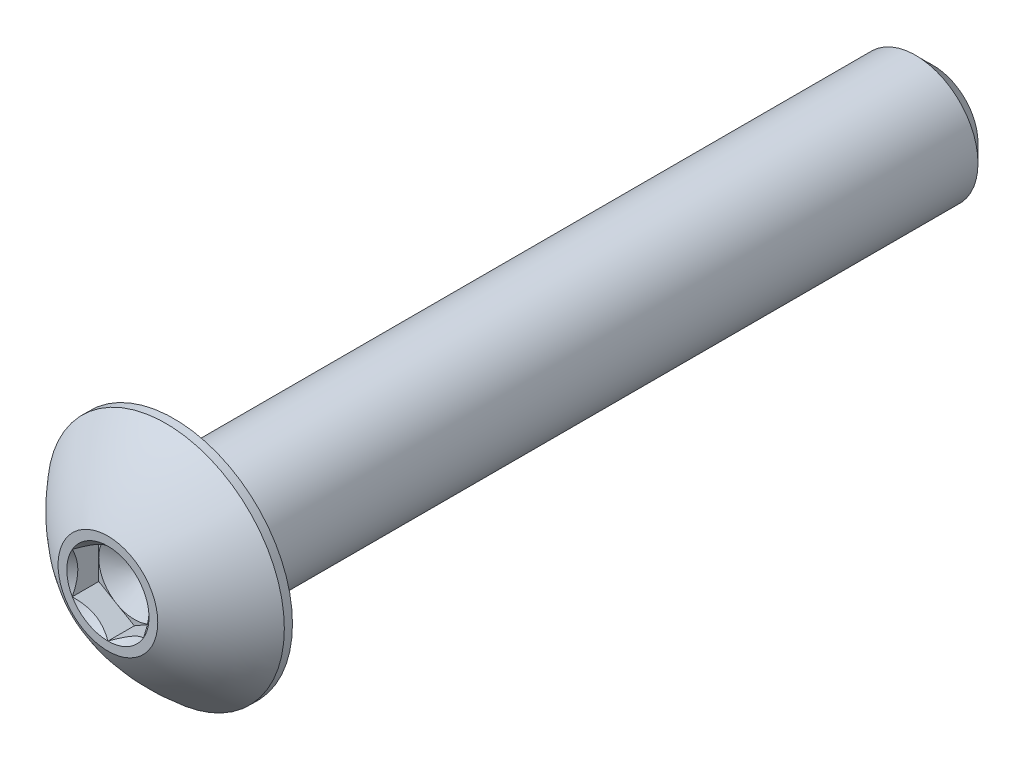
ISO-10303-21;
HEADER;
FILE_DESCRIPTION(('STEP AP214'),'2;1');
FILE_NAME('part.step','',(''),(''),'','','');
FILE_SCHEMA(('AUTOMOTIVE_DESIGN { 1 0 10303 214 1 1 1 1 }'));
ENDSEC;
DATA;
#1=APPLICATION_CONTEXT('core data for automotive mechanical design processes');
#2=APPLICATION_PROTOCOL_DEFINITION('international standard','automotive_design',2000,#1);
#3=PRODUCT_CONTEXT('',#1,'mechanical');
#4=PRODUCT('Part','Part','',(#3));
#5=PRODUCT_RELATED_PRODUCT_CATEGORY('part','',(#4));
#6=PRODUCT_DEFINITION_FORMATION('','',#4);
#7=PRODUCT_DEFINITION_CONTEXT('part definition',#1,'design');
#8=PRODUCT_DEFINITION('design','',#6,#7);
#9=PRODUCT_DEFINITION_SHAPE('','',#8);
#10=(LENGTH_UNIT() NAMED_UNIT(*) SI_UNIT(.MILLI.,.METRE.));
#11=(NAMED_UNIT(*) PLANE_ANGLE_UNIT() SI_UNIT($,.RADIAN.));
#12=(NAMED_UNIT(*) SI_UNIT($,.STERADIAN.) SOLID_ANGLE_UNIT());
#13=UNCERTAINTY_MEASURE_WITH_UNIT(LENGTH_MEASURE(1.E-05),#10,'distance_accuracy_value','');
#14=(GEOMETRIC_REPRESENTATION_CONTEXT(3) GLOBAL_UNCERTAINTY_ASSIGNED_CONTEXT((#13)) GLOBAL_UNIT_ASSIGNED_CONTEXT((#10,
#11,#12)) REPRESENTATION_CONTEXT('',''));
#15=CARTESIAN_POINT('',(0.,0.,0.));
#16=DIRECTION('',(0.,0.,1.));
#17=DIRECTION('',(1.,0.,0.));
#18=AXIS2_PLACEMENT_3D('',#15,#16,#17);
#19=CARTESIAN_POINT('',(0.,1.190625,13.8049));
#20=DIRECTION('',(0.,0.,-1.));
#21=DIRECTION('',(-1.,0.,0.));
#22=AXIS2_PLACEMENT_3D('',#19,#20,#21);
#23=PLANE('',#22);
#24=CARTESIAN_POINT('',(0.,0.,13.8049));
#25=DIRECTION('',(0.,0.,1.));
#26=DIRECTION('',(1.,0.,0.));
#27=AXIS2_PLACEMENT_3D('',#24,#25,#26);
#28=CIRCLE('',#27,1.666875);
#29=CARTESIAN_POINT('',(1.666875,0.,13.8049));
#30=VERTEX_POINT('',#29);
#31=EDGE_CURVE('E169',#30,#30,#28,.T.);
#32=ORIENTED_EDGE('',*,*,#31,.T.);
#33=EDGE_LOOP('',(#32));
#34=FACE_BOUND('',#33,.T.);
#35=CARTESIAN_POINT('',(0.,0.,13.8049));
#36=DIRECTION('',(0.,0.,1.));
#37=DIRECTION('',(1.,0.,0.));
#38=AXIS2_PLACEMENT_3D('',#35,#36,#37);
#39=CIRCLE('',#38,1.37481532850779);
#40=CARTESIAN_POINT('',(0.,1.3748153285078,13.8049));
#41=VERTEX_POINT('',#40);
#42=CARTESIAN_POINT('',(-1.190625,0.687407664253895,13.8049));
#43=VERTEX_POINT('',#42);
#44=EDGE_CURVE('E123',#41,#43,#39,.T.);
#45=ORIENTED_EDGE('',*,*,#44,.F.);
#46=CARTESIAN_POINT('',(0.,0.,13.8049));
#47=DIRECTION('',(0.,0.,1.));
#48=DIRECTION('',(1.,0.,0.));
#49=AXIS2_PLACEMENT_3D('',#46,#47,#48);
#50=CIRCLE('',#49,1.37481532850779);
#51=CARTESIAN_POINT('',(1.190625,0.687407664253901,13.8049));
#52=VERTEX_POINT('',#51);
#53=EDGE_CURVE('E108',#52,#41,#50,.T.);
#54=ORIENTED_EDGE('',*,*,#53,.F.);
#55=CARTESIAN_POINT('',(0.,0.,13.8049));
#56=DIRECTION('',(0.,0.,1.));
#57=DIRECTION('',(1.,0.,0.));
#58=AXIS2_PLACEMENT_3D('',#55,#56,#57);
#59=CIRCLE('',#58,1.37481532850779);
#60=CARTESIAN_POINT('',(1.190625,-0.6874076642539,13.8049));
#61=VERTEX_POINT('',#60);
#62=EDGE_CURVE('E119',#61,#52,#59,.T.);
#63=ORIENTED_EDGE('',*,*,#62,.F.);
#64=CARTESIAN_POINT('',(0.,0.,13.8049));
#65=DIRECTION('',(0.,0.,1.));
#66=DIRECTION('',(1.,0.,0.));
#67=AXIS2_PLACEMENT_3D('',#64,#65,#66);
#68=CIRCLE('',#67,1.37481532850779);
#69=CARTESIAN_POINT('',(0.,-1.3748153285078,13.8049));
#70=VERTEX_POINT('',#69);
#71=EDGE_CURVE('E140',#70,#61,#68,.T.);
#72=ORIENTED_EDGE('',*,*,#71,.F.);
#73=CARTESIAN_POINT('',(0.,0.,13.8049));
#74=DIRECTION('',(0.,0.,1.));
#75=DIRECTION('',(1.,0.,0.));
#76=AXIS2_PLACEMENT_3D('',#73,#74,#75);
#77=CIRCLE('',#76,1.37481532850779);
#78=CARTESIAN_POINT('',(-1.190625,-0.687407664253895,13.8049));
#79=VERTEX_POINT('',#78);
#80=EDGE_CURVE('E396',#79,#70,#77,.T.);
#81=ORIENTED_EDGE('',*,*,#80,.F.);
#82=CARTESIAN_POINT('',(0.,0.,13.8049));
#83=DIRECTION('',(0.,0.,1.));
#84=DIRECTION('',(1.,0.,0.));
#85=AXIS2_PLACEMENT_3D('',#82,#83,#84);
#86=CIRCLE('',#85,1.37481532850779);
#87=EDGE_CURVE('E405',#43,#79,#86,.T.);
#88=ORIENTED_EDGE('',*,*,#87,.F.);
#89=EDGE_LOOP('',(#45,#54,#63,#72,#81,#88));
#90=FACE_BOUND('',#89,.T.);
#91=ADVANCED_FACE('F35',(#34,#90),#23,.F.);
#92=CARTESIAN_POINT('',(0.,0.,-13.8049));
#93=DIRECTION('',(0.,0.,1.));
#94=DIRECTION('',(1.,0.,0.));
#95=AXIS2_PLACEMENT_3D('',#92,#93,#94);
#96=CONICAL_SURFACE('',#95,1.4874875,0.785398163397447);
#97=CARTESIAN_POINT('',(0.,0.,-13.2095875));
#98=DIRECTION('',(0.,0.,1.));
#99=DIRECTION('',(1.,0.,0.));
#100=AXIS2_PLACEMENT_3D('',#97,#98,#99);
#101=CIRCLE('',#100,2.0828);
#102=CARTESIAN_POINT('',(2.0828,0.,-13.2095875));
#103=VERTEX_POINT('',#102);
#104=EDGE_CURVE('E11',#103,#103,#101,.T.);
#105=ORIENTED_EDGE('',*,*,#104,.F.);
#106=EDGE_LOOP('',(#105));
#107=FACE_BOUND('',#106,.T.);
#108=CARTESIAN_POINT('',(0.,0.,-13.8049));
#109=DIRECTION('',(0.,0.,1.));
#110=DIRECTION('',(1.,0.,0.));
#111=AXIS2_PLACEMENT_3D('',#108,#109,#110);
#112=CIRCLE('',#111,1.4874875);
#113=CARTESIAN_POINT('',(1.4874875,0.,-13.8049));
#114=VERTEX_POINT('',#113);
#115=EDGE_CURVE('E162',#114,#114,#112,.T.);
#116=ORIENTED_EDGE('',*,*,#115,.T.);
#117=EDGE_LOOP('',(#116));
#118=FACE_BOUND('',#117,.T.);
#119=ADVANCED_FACE('F37',(#107,#118),#96,.T.);
#120=CARTESIAN_POINT('',(0.,0.,13.8049));
#121=DIRECTION('',(0.,0.,1.));
#122=DIRECTION('',(1.,0.,0.));
#123=AXIS2_PLACEMENT_3D('',#120,#121,#122);
#124=CYLINDRICAL_SURFACE('',#123,2.0828);
#125=CARTESIAN_POINT('',(0.,0.,11.5951));
#126=DIRECTION('',(0.,0.,1.));
#127=DIRECTION('',(1.,0.,0.));
#128=AXIS2_PLACEMENT_3D('',#125,#126,#127);
#129=CIRCLE('',#128,2.0828);
#130=CARTESIAN_POINT('',(2.0828,0.,11.5951));
#131=VERTEX_POINT('',#130);
#132=EDGE_CURVE('E43',#131,#131,#129,.T.);
#133=ORIENTED_EDGE('',*,*,#132,.F.);
#134=EDGE_LOOP('',(#133));
#135=FACE_BOUND('',#134,.T.);
#136=ORIENTED_EDGE('',*,*,#104,.T.);
#137=EDGE_LOOP('',(#136));
#138=FACE_BOUND('',#137,.T.);
#139=ADVANCED_FACE('F183',(#135,#138),#124,.T.);
#140=CARTESIAN_POINT('',(0.,3.9624,11.5951));
#141=DIRECTION('',(0.,0.,1.));
#142=DIRECTION('',(1.,0.,0.));
#143=AXIS2_PLACEMENT_3D('',#140,#141,#142);
#144=PLANE('',#143);
#145=CARTESIAN_POINT('',(0.,0.,11.5951));
#146=DIRECTION('',(0.,0.,1.));
#147=DIRECTION('',(1.,0.,0.));
#148=AXIS2_PLACEMENT_3D('',#145,#146,#147);
#149=CIRCLE('',#148,3.9624);
#150=CARTESIAN_POINT('',(3.9624,0.,11.5951));
#151=VERTEX_POINT('',#150);
#152=EDGE_CURVE('E176',#151,#151,#149,.T.);
#153=ORIENTED_EDGE('',*,*,#152,.F.);
#154=EDGE_LOOP('',(#153));
#155=FACE_BOUND('',#154,.T.);
#156=ORIENTED_EDGE('',*,*,#132,.T.);
#157=EDGE_LOOP('',(#156));
#158=FACE_BOUND('',#157,.T.);
#159=ADVANCED_FACE('F181',(#155,#158),#144,.F.);
#160=CARTESIAN_POINT('',(0.,0.,13.8049));
#161=DIRECTION('',(0.,0.,1.));
#162=DIRECTION('',(1.,0.,0.));
#163=AXIS2_PLACEMENT_3D('',#160,#161,#162);
#164=CYLINDRICAL_SURFACE('',#163,3.9624);
#165=CARTESIAN_POINT('',(0.,0.,11.8672428571429));
#166=DIRECTION('',(0.,0.,1.));
#167=DIRECTION('',(1.,0.,0.));
#168=AXIS2_PLACEMENT_3D('',#165,#166,#167);
#169=CIRCLE('',#168,3.9624);
#170=CARTESIAN_POINT('',(3.9624,0.,11.8672428571429));
#171=VERTEX_POINT('',#170);
#172=EDGE_CURVE('E173',#171,#171,#169,.T.);
#173=ORIENTED_EDGE('',*,*,#172,.F.);
#174=EDGE_LOOP('',(#173));
#175=FACE_BOUND('',#174,.T.);
#176=ORIENTED_EDGE('',*,*,#152,.T.);
#177=EDGE_LOOP('',(#176));
#178=FACE_BOUND('',#177,.T.);
#179=ADVANCED_FACE('F203',(#175,#178),#164,.T.);
#180=CARTESIAN_POINT('',(0.,0.,6.43642703996249));
#181=DIRECTION('',(0.,0.,1.));
#182=DIRECTION('',(1.,0.,0.));
#183=AXIS2_PLACEMENT_3D('',#180,#181,#182);
#184=DEGENERATE_TOROIDAL_SURFACE('',#183,2.58731484699415,8.50837969398828,.F.);
#185=ORIENTED_EDGE('',*,*,#31,.F.);
#186=EDGE_LOOP('',(#185));
#187=FACE_BOUND('',#186,.T.);
#188=ORIENTED_EDGE('',*,*,#172,.T.);
#189=EDGE_LOOP('',(#188));
#190=FACE_BOUND('',#189,.T.);
#191=ADVANCED_FACE('F194',(#187,#190),#184,.F.);
#192=CARTESIAN_POINT('',(0.,1.4874875,-13.8049));
#193=DIRECTION('',(0.,0.,1.));
#194=DIRECTION('',(1.,0.,0.));
#195=AXIS2_PLACEMENT_3D('',#192,#193,#194);
#196=PLANE('',#195);
#197=ORIENTED_EDGE('',*,*,#115,.F.);
#198=EDGE_LOOP('',(#197));
#199=FACE_BOUND('',#198,.T.);
#200=ADVANCED_FACE('F192',(#199),#196,.F.);
#201=CARTESIAN_POINT('',(1.190625,0.687407664253899,13.8049));
#202=DIRECTION('',(-0.499999999999999,-0.866025403784439,0.));
#203=DIRECTION('',(0.866025403784439,-0.499999999999999,0.));
#204=AXIS2_PLACEMENT_3D('',#201,#202,#203);
#205=PLANE('',#204);
#206=CARTESIAN_POINT('',(1.190825,0.687292194200061,13.8050154846));
#207=CARTESIAN_POINT('',(1.14989058041014,0.710925692369386,13.7813987642143));
#208=CARTESIAN_POINT('',(1.10827161169802,0.734954415158721,13.7591687817231));
#209=CARTESIAN_POINT('',(1.02340555632636,0.78395185507261,13.7184656626274));
#210=CARTESIAN_POINT('',(0.980150392709037,0.808925235430915,13.7000151826476));
#211=CARTESIAN_POINT('',(0.892928352542574,0.859282903800291,13.6684088380043));
#212=CARTESIAN_POINT('',(0.848983705042073,0.884654357864148,13.6551735042433));
#213=CARTESIAN_POINT('',(0.760126625836305,0.935956016463003,13.6347814515754));
#214=CARTESIAN_POINT('',(0.715216911165243,0.961884652317569,13.627609502896));
#215=CARTESIAN_POINT('',(0.63782087234302,1.00656927616579,13.6211385386489));
#216=CARTESIAN_POINT('',(0.605434587484352,1.02526750644699,13.6201803201468));
#217=CARTESIAN_POINT('',(0.540718926682229,1.06263111063188,13.6217926490721));
#218=CARTESIAN_POINT('',(0.508389564872726,1.08129647637533,13.6243639751796));
#219=CARTESIAN_POINT('',(0.444042843928514,1.11844707303394,13.6328867539936));
#220=CARTESIAN_POINT('',(0.412025803663231,1.13693211984976,13.6388413547526));
#221=CARTESIAN_POINT('',(0.348526236603542,1.17359361198509,13.6538099640712));
#222=CARTESIAN_POINT('',(0.317043945355834,1.19176992131166,13.6628252859121));
#223=CARTESIAN_POINT('',(0.236410161427872,1.23832385816825,13.689582295838));
#224=CARTESIAN_POINT('',(0.18776716473234,1.2664079054046,13.709336814436));
#225=CARTESIAN_POINT('',(0.0923855836478791,1.32147648691945,13.7538367689577));
#226=CARTESIAN_POINT('',(0.0456413824128425,1.34846426408555,13.7785659647162));
#227=CARTESIAN_POINT('',(-0.000200000000002112,1.37493079856163,13.8050154846));
#228=B_SPLINE_CURVE_WITH_KNOTS('',3,(#206,#207,#208,#209,#210,#211,#212,#213,#214,#215,#216,
#217,#218,#219,#220,#221,#222,#223,#224,#225,#226,#227),.UNSPECIFIED.,.F.,.F.,(4,2,2,2,2,2,2,2,
2,2,4),(0.,0.158625672934119,0.31817607984327,0.475191357500654,0.631811068630747,
0.743878551794716,0.855970763007026,0.968167444423239,1.08041232768376,1.25873351645467,
1.43648174479847),.UNSPECIFIED.);
#229=EDGE_CURVE('E105',#52,#41,#228,.T.);
#230=ORIENTED_EDGE('',*,*,#229,.T.);
#231=DIRECTION('',(0.,0.,-1.));
#232=VECTOR('',#231,1.);
#233=CARTESIAN_POINT('',(0.,1.37481532850779,13.8049));
#234=LINE('',#233,#232);
#235=CARTESIAN_POINT('',(0.,1.37481532850779,12.92098));
#236=VERTEX_POINT('',#235);
#237=EDGE_CURVE('E160',#41,#236,#234,.T.);
#238=ORIENTED_EDGE('',*,*,#237,.T.);
#239=DIRECTION('',(-0.866025403784439,0.499999999999999,0.));
#240=VECTOR('',#239,1.);
#241=CARTESIAN_POINT('',(1.190625,0.687407664253899,12.92098));
#242=LINE('',#241,#240);
#243=CARTESIAN_POINT('',(0.595312499999999,1.03111149638085,12.92098));
#244=VERTEX_POINT('',#243);
#245=EDGE_CURVE('E432',#244,#236,#242,.T.);
#246=ORIENTED_EDGE('',*,*,#245,.F.);
#247=CARTESIAN_POINT('',(1.190625,0.687407664253899,12.92098));
#248=VERTEX_POINT('',#247);
#249=EDGE_CURVE('E50',#248,#244,#242,.T.);
#250=ORIENTED_EDGE('',*,*,#249,.F.);
#251=DIRECTION('',(0.,0.,-1.));
#252=VECTOR('',#251,1.);
#253=CARTESIAN_POINT('',(1.190625,0.687407664253899,13.8049));
#254=LINE('',#253,#252);
#255=EDGE_CURVE('E136',#52,#248,#254,.T.);
#256=ORIENTED_EDGE('',*,*,#255,.F.);
#257=EDGE_LOOP('',(#230,#238,#246,#250,#256));
#258=FACE_BOUND('',#257,.T.);
#259=ADVANCED_FACE('F142',(#258),#205,.T.);
#260=CARTESIAN_POINT('',(0.,1.37481532850779,13.8049));
#261=DIRECTION('',(0.5,-0.866025403784439,0.));
#262=DIRECTION('',(0.866025403784439,0.5,0.));
#263=AXIS2_PLACEMENT_3D('',#260,#261,#262);
#264=PLANE('',#263);
#265=CARTESIAN_POINT('',(0.00019999999999857,1.37493079856163,13.8050154846));
#266=CARTESIAN_POINT('',(-0.0407344195898575,1.35129730039231,13.7813987642143));
#267=CARTESIAN_POINT('',(-0.0823533883019747,1.32726857760297,13.7591687817231));
#268=CARTESIAN_POINT('',(-0.167219443673633,1.27827113768908,13.7184656626274));
#269=CARTESIAN_POINT('',(-0.210474607290961,1.25329775733078,13.7000151826475));
#270=CARTESIAN_POINT('',(-0.297696647457425,1.2029400889614,13.6684088380043));
#271=CARTESIAN_POINT('',(-0.341641294957926,1.17756863489755,13.6551735042433));
#272=CARTESIAN_POINT('',(-0.430498374163694,1.12626697629869,13.6347814515754));
#273=CARTESIAN_POINT('',(-0.475408088834755,1.10033834044412,13.627609502896));
#274=CARTESIAN_POINT('',(-0.552804127656978,1.0556537165959,13.6211385386489));
#275=CARTESIAN_POINT('',(-0.585190412515646,1.0369554863147,13.6201803201468));
#276=CARTESIAN_POINT('',(-0.649906073317769,0.999591882129809,13.6217926490721));
#277=CARTESIAN_POINT('',(-0.682235435127272,0.980926516386364,13.6243639751796));
#278=CARTESIAN_POINT('',(-0.746582156071484,0.943775919727753,13.6328867539936));
#279=CARTESIAN_POINT('',(-0.778599196336767,0.925290872911937,13.6388413547526));
#280=CARTESIAN_POINT('',(-0.842098763396457,0.8886293807766,13.6538099640712));
#281=CARTESIAN_POINT('',(-0.873581054644164,0.87045307145003,13.6628252859121));
#282=CARTESIAN_POINT('',(-0.954214838572127,0.823899134593443,13.689582295838));
#283=CARTESIAN_POINT('',(-1.00285783526766,0.795815087357088,13.709336814436));
#284=CARTESIAN_POINT('',(-1.09823941635212,0.740746505842242,13.7538367689577));
#285=CARTESIAN_POINT('',(-1.14498361758716,0.71375872867614,13.7785659647162));
#286=CARTESIAN_POINT('',(-1.190825,0.687292194200059,13.8050154846));
#287=B_SPLINE_CURVE_WITH_KNOTS('',3,(#265,#266,#267,#268,#269,#270,#271,#272,#273,#274,#275,
#276,#277,#278,#279,#280,#281,#282,#283,#284,#285,#286),.UNSPECIFIED.,.F.,.F.,(4,2,2,2,2,2,2,2,
2,2,4),(0.,0.15862567293412,0.318176079843271,0.475191357500654,0.631811068630747,
0.743878551794716,0.855970763007027,0.96816744442324,1.08041232768376,1.25873351645467,
1.43648174479847),.UNSPECIFIED.);
#288=EDGE_CURVE('E420',#41,#43,#287,.T.);
#289=ORIENTED_EDGE('',*,*,#288,.T.);
#290=DIRECTION('',(0.,0.,-1.));
#291=VECTOR('',#290,1.);
#292=CARTESIAN_POINT('',(-1.190625,0.687407664253897,13.8049));
#293=LINE('',#292,#291);
#294=CARTESIAN_POINT('',(-1.190625,0.687407664253897,12.92098));
#295=VERTEX_POINT('',#294);
#296=EDGE_CURVE('E157',#43,#295,#293,.T.);
#297=ORIENTED_EDGE('',*,*,#296,.T.);
#298=DIRECTION('',(-0.866025403784438,-0.5,0.));
#299=VECTOR('',#298,1.);
#300=CARTESIAN_POINT('',(0.,1.37481532850779,12.92098));
#301=LINE('',#300,#299);
#302=CARTESIAN_POINT('',(-0.5953125,1.03111149638085,12.92098));
#303=VERTEX_POINT('',#302);
#304=EDGE_CURVE('E434',#303,#295,#301,.T.);
#305=ORIENTED_EDGE('',*,*,#304,.F.);
#306=EDGE_CURVE('E435',#236,#303,#301,.T.);
#307=ORIENTED_EDGE('',*,*,#306,.F.);
#308=ORIENTED_EDGE('',*,*,#237,.F.);
#309=EDGE_LOOP('',(#289,#297,#305,#307,#308));
#310=FACE_BOUND('',#309,.T.);
#311=ADVANCED_FACE('F201',(#310),#264,.T.);
#312=CARTESIAN_POINT('',(-1.190625,0.687407664253897,13.8049));
#313=DIRECTION('',(1.,0.,0.));
#314=DIRECTION('',(0.,1.,0.));
#315=AXIS2_PLACEMENT_3D('',#312,#313,#314);
#316=PLANE('',#315);
#317=CARTESIAN_POINT('',(-1.190625,-1.33257496176315,14.2170776539471));
#318=CARTESIAN_POINT('',(-1.190625,-1.29994871423566,14.1927517507382));
#319=CARTESIAN_POINT('',(-1.190625,-1.26713658172592,14.1686758153418));
#320=CARTESIAN_POINT('',(-1.190625,-1.20106652666898,14.1211258905442));
#321=CARTESIAN_POINT('',(-1.190625,-1.16780849029641,14.0976520594744));
#322=CARTESIAN_POINT('',(-1.190625,-1.06676850998873,14.0279528021059));
#323=CARTESIAN_POINT('',(-1.190625,-0.998216816413859,13.9828244430562));
#324=CARTESIAN_POINT('',(-1.190625,-0.854708873099823,13.8945746038978));
#325=CARTESIAN_POINT('',(-1.190625,-0.779606053905837,13.8516886379598));
#326=CARTESIAN_POINT('',(-1.190625,-0.625699933788276,13.7734827621873));
#327=CARTESIAN_POINT('',(-1.190625,-0.546910204142435,13.7381374138711));
#328=CARTESIAN_POINT('',(-1.190625,-0.428270822863893,13.6949081103375));
#329=CARTESIAN_POINT('',(-1.190625,-0.390097157889893,13.6824393065679));
#330=CARTESIAN_POINT('',(-1.190625,-0.312861852648325,13.6605717414076));
#331=CARTESIAN_POINT('',(-1.190625,-0.273800148194846,13.6511732026896));
#332=CARTESIAN_POINT('',(-1.190625,-0.19565680432425,13.6360809931601));
#333=CARTESIAN_POINT('',(-1.190625,-0.15658716758519,13.6303261223414));
#334=CARTESIAN_POINT('',(-1.190625,-0.078072192550454,13.6226274936869));
#335=CARTESIAN_POINT('',(-1.190625,-0.0386269124664312,13.6206831547062));
#336=CARTESIAN_POINT('',(-1.190625,0.0389916055329488,13.6207358865562));
#337=CARTESIAN_POINT('',(-1.190625,0.0771649838909039,13.6226082985348));
#338=CARTESIAN_POINT('',(-1.190625,0.15316931690131,13.629925032677));
#339=CARTESIAN_POINT('',(-1.190625,0.191000202066014,13.6353700639159));
#340=CARTESIAN_POINT('',(-1.190625,0.266679875667627,13.6496337404319));
#341=CARTESIAN_POINT('',(-1.190625,0.304517960496567,13.6585083513185));
#342=CARTESIAN_POINT('',(-1.190625,0.379371812103033,13.6791711899478));
#343=CARTESIAN_POINT('',(-1.190625,0.41638766004582,13.6909591287023));
#344=CARTESIAN_POINT('',(-1.190625,0.534752604370335,13.7330388624574));
#345=CARTESIAN_POINT('',(-1.190625,0.614367820141192,13.7681973626664));
#346=CARTESIAN_POINT('',(-1.190625,0.769840121594401,13.8463109296483));
#347=CARTESIAN_POINT('',(-1.190625,0.845682198950472,13.8892943854746));
#348=CARTESIAN_POINT('',(-1.190625,0.990597219171117,13.9779106157189));
#349=CARTESIAN_POINT('',(-1.190625,1.05981896192243,14.0233030277464));
#350=CARTESIAN_POINT('',(-1.190625,1.16180435559073,14.0934487362735));
#351=CARTESIAN_POINT('',(-1.190625,1.19535834820322,14.1170729140236));
#352=CARTESIAN_POINT('',(-1.190625,1.26200934527368,14.1649391402926));
#353=CARTESIAN_POINT('',(-1.190625,1.29510647170251,14.1891810187836));
#354=CARTESIAN_POINT('',(-1.190625,1.32801361492664,14.2136788103185));
#355=B_SPLINE_CURVE_WITH_KNOTS('',3,(#317,#318,#319,#320,#321,#322,#323,#324,#325,#326,#327,
#328,#329,#330,#331,#332,#333,#334,#335,#336,#337,#338,#339,#340,#341,#342,#343,#344,#345,#346,
#347,#348,#349,#350,#351,#352,#353,#354),.UNSPECIFIED.,.F.,.F.,(4,2,2,2,2,2,2,2,2,2,2,2,2,2,2,2,
2,2,4),(0.,0.122086892163024,0.244205566236856,0.490307097949236,0.749538212338037,
1.00788046850428,1.12825296528965,1.24863419022022,1.36693571627758,1.48521919874151,
1.59970134751387,1.71420622500211,1.83066442982696,1.94711108719178,2.20743843130379,
2.46872978374271,2.7169401091647,2.84004418874365,2.96311474121228),.UNSPECIFIED.);
#356=EDGE_CURVE('E413',#43,#79,#355,.F.);
#357=ORIENTED_EDGE('',*,*,#356,.T.);
#358=DIRECTION('',(0.,0.,-1.));
#359=VECTOR('',#358,1.);
#360=CARTESIAN_POINT('',(-1.190625,-0.687407664253895,13.8049));
#361=LINE('',#360,#359);
#362=CARTESIAN_POINT('',(-1.190625,-0.687407664253895,12.92098));
#363=VERTEX_POINT('',#362);
#364=EDGE_CURVE('E154',#79,#363,#361,.T.);
#365=ORIENTED_EDGE('',*,*,#364,.T.);
#366=DIRECTION('',(0.,-1.,0.));
#367=VECTOR('',#366,1.);
#368=CARTESIAN_POINT('',(-1.190625,0.687407664253897,12.92098));
#369=LINE('',#368,#367);
#370=CARTESIAN_POINT('',(-1.190625,0.,12.92098));
#371=VERTEX_POINT('',#370);
#372=EDGE_CURVE('E438',#371,#363,#369,.T.);
#373=ORIENTED_EDGE('',*,*,#372,.F.);
#374=EDGE_CURVE('E439',#295,#371,#369,.T.);
#375=ORIENTED_EDGE('',*,*,#374,.F.);
#376=ORIENTED_EDGE('',*,*,#296,.F.);
#377=EDGE_LOOP('',(#357,#365,#373,#375,#376));
#378=FACE_BOUND('',#377,.T.);
#379=ADVANCED_FACE('F256',(#378),#316,.T.);
#380=CARTESIAN_POINT('',(-1.190625,-0.687407664253895,13.8049));
#381=DIRECTION('',(0.5,0.866025403784439,0.));
#382=DIRECTION('',(-0.866025403784439,0.5,0.));
#383=AXIS2_PLACEMENT_3D('',#380,#381,#382);
#384=PLANE('',#383);
#385=CARTESIAN_POINT('',(-1.190825,-0.687292194200058,13.8050154846));
#386=CARTESIAN_POINT('',(-1.14989058041014,-0.710925692369382,13.7813987642143));
#387=CARTESIAN_POINT('',(-1.10827161169803,-0.734954415158718,13.7591687817231));
#388=CARTESIAN_POINT('',(-1.02340555632637,-0.783951855072607,13.7184656626274));
#389=CARTESIAN_POINT('',(-0.980150392709039,-0.808925235430912,13.7000151826476));
#390=CARTESIAN_POINT('',(-0.892928352542575,-0.859282903800288,13.6684088380043));
#391=CARTESIAN_POINT('',(-0.848983705042074,-0.884654357864146,13.6551735042433));
#392=CARTESIAN_POINT('',(-0.760126625836306,-0.935956016463,13.6347814515754));
#393=CARTESIAN_POINT('',(-0.715216911165244,-0.961884652317567,13.627609502896));
#394=CARTESIAN_POINT('',(-0.637820872343021,-1.00656927616579,13.6211385386489));
#395=CARTESIAN_POINT('',(-0.605434587484352,-1.02526750644699,13.6201803201468));
#396=CARTESIAN_POINT('',(-0.540718926682229,-1.06263111063188,13.6217926490721));
#397=CARTESIAN_POINT('',(-0.508389564872727,-1.08129647637533,13.6243639751796));
#398=CARTESIAN_POINT('',(-0.444042843928515,-1.11844707303394,13.6328867539936));
#399=CARTESIAN_POINT('',(-0.412025803663232,-1.13693211984975,13.6388413547526));
#400=CARTESIAN_POINT('',(-0.348526236603543,-1.17359361198509,13.6538099640712));
#401=CARTESIAN_POINT('',(-0.317043945355836,-1.19176992131166,13.6628252859121));
#402=CARTESIAN_POINT('',(-0.236410161427873,-1.23832385816825,13.689582295838));
#403=CARTESIAN_POINT('',(-0.187767164732342,-1.2664079054046,13.709336814436));
#404=CARTESIAN_POINT('',(-0.0923855836478816,-1.32147648691945,13.7538367689577));
#405=CARTESIAN_POINT('',(-0.0456413824128452,-1.34846426408555,13.7785659647162));
#406=CARTESIAN_POINT('',(0.000199999999999388,-1.37493079856163,13.8050154846));
#407=B_SPLINE_CURVE_WITH_KNOTS('',3,(#385,#386,#387,#388,#389,#390,#391,#392,#393,#394,#395,
#396,#397,#398,#399,#400,#401,#402,#403,#404,#405,#406),.UNSPECIFIED.,.F.,.F.,(4,2,2,2,2,2,2,2,
2,2,4),(0.,0.15862567293412,0.318176079843271,0.475191357500655,0.631811068630749,
0.743878551794718,0.855970763007029,0.968167444423241,1.08041232768376,1.25873351645467,
1.43648174479846),.UNSPECIFIED.);
#408=EDGE_CURVE('E398',#79,#70,#407,.T.);
#409=ORIENTED_EDGE('',*,*,#408,.T.);
#410=DIRECTION('',(0.,0.,-1.));
#411=VECTOR('',#410,1.);
#412=CARTESIAN_POINT('',(0.,-1.37481532850779,13.8049));
#413=LINE('',#412,#411);
#414=CARTESIAN_POINT('',(0.,-1.37481532850779,12.92098));
#415=VERTEX_POINT('',#414);
#416=EDGE_CURVE('E145',#70,#415,#413,.T.);
#417=ORIENTED_EDGE('',*,*,#416,.T.);
#418=DIRECTION('',(0.866025403784439,-0.5,0.));
#419=VECTOR('',#418,1.);
#420=CARTESIAN_POINT('',(-1.190625,-0.687407664253895,12.92098));
#421=LINE('',#420,#419);
#422=CARTESIAN_POINT('',(-0.595312499999998,-1.03111149638084,12.92098));
#423=VERTEX_POINT('',#422);
#424=EDGE_CURVE('E442',#423,#415,#421,.T.);
#425=ORIENTED_EDGE('',*,*,#424,.F.);
#426=EDGE_CURVE('E443',#363,#423,#421,.T.);
#427=ORIENTED_EDGE('',*,*,#426,.F.);
#428=ORIENTED_EDGE('',*,*,#364,.F.);
#429=EDGE_LOOP('',(#409,#417,#425,#427,#428));
#430=FACE_BOUND('',#429,.T.);
#431=ADVANCED_FACE('F264',(#430),#384,.T.);
#432=CARTESIAN_POINT('',(0.,-1.37481532850779,13.8049));
#433=DIRECTION('',(-0.5,0.866025403784438,0.));
#434=DIRECTION('',(-0.866025403784438,-0.5,0.));
#435=AXIS2_PLACEMENT_3D('',#432,#433,#434);
#436=PLANE('',#435);
#437=CARTESIAN_POINT('',(-0.000200000000000125,-1.37493079856163,13.8050154846));
#438=CARTESIAN_POINT('',(0.0407344195898563,-1.35129730039231,13.7813987642143));
#439=CARTESIAN_POINT('',(0.0823533883019738,-1.32726857760297,13.7591687817231));
#440=CARTESIAN_POINT('',(0.167219443673632,-1.27827113768908,13.7184656626274));
#441=CARTESIAN_POINT('',(0.21047460729096,-1.25329775733078,13.7000151826475));
#442=CARTESIAN_POINT('',(0.297696647457423,-1.2029400889614,13.6684088380043));
#443=CARTESIAN_POINT('',(0.341641294957924,-1.17756863489754,13.6551735042433));
#444=CARTESIAN_POINT('',(0.430498374163693,-1.12626697629869,13.6347814515754));
#445=CARTESIAN_POINT('',(0.475408088834754,-1.10033834044412,13.627609502896));
#446=CARTESIAN_POINT('',(0.552804127656977,-1.0556537165959,13.6211385386489));
#447=CARTESIAN_POINT('',(0.585190412515645,-1.0369554863147,13.6201803201468));
#448=CARTESIAN_POINT('',(0.649906073317768,-0.999591882129806,13.6217926490721));
#449=CARTESIAN_POINT('',(0.682235435127271,-0.980926516386361,13.6243639751796));
#450=CARTESIAN_POINT('',(0.746582156071482,-0.94377591972775,13.6328867539936));
#451=CARTESIAN_POINT('',(0.778599196336766,-0.925290872911934,13.6388413547526));
#452=CARTESIAN_POINT('',(0.842098763396455,-0.888629380776598,13.6538099640712));
#453=CARTESIAN_POINT('',(0.873581054644162,-0.870453071450028,13.6628252859121));
#454=CARTESIAN_POINT('',(0.954214838572124,-0.823899134593441,13.689582295838));
#455=CARTESIAN_POINT('',(1.00285783526766,-0.795815087357086,13.709336814436));
#456=CARTESIAN_POINT('',(1.09823941635212,-0.74074650584224,13.7538367689577));
#457=CARTESIAN_POINT('',(1.14498361758715,-0.713758728676138,13.7785659647162));
#458=CARTESIAN_POINT('',(1.190825,-0.687292194200058,13.8050154846));
#459=B_SPLINE_CURVE_WITH_KNOTS('',3,(#437,#438,#439,#440,#441,#442,#443,#444,#445,#446,#447,
#448,#449,#450,#451,#452,#453,#454,#455,#456,#457,#458),.UNSPECIFIED.,.F.,.F.,(4,2,2,2,2,2,2,2,
2,2,4),(0.,0.15862567293412,0.31817607984327,0.475191357500655,0.631811068630747,
0.743878551794716,0.855970763007027,0.96816744442324,1.08041232768376,1.25873351645467,
1.43648174479846),.UNSPECIFIED.);
#460=EDGE_CURVE('E389',#70,#61,#459,.T.);
#461=ORIENTED_EDGE('',*,*,#460,.T.);
#462=DIRECTION('',(0.,0.,-1.));
#463=VECTOR('',#462,1.);
#464=CARTESIAN_POINT('',(1.190625,-0.687407664253895,13.8049));
#465=LINE('',#464,#463);
#466=CARTESIAN_POINT('',(1.190625,-0.687407664253895,12.92098));
#467=VERTEX_POINT('',#466);
#468=EDGE_CURVE('E139',#61,#467,#465,.T.);
#469=ORIENTED_EDGE('',*,*,#468,.T.);
#470=DIRECTION('',(0.866025403784438,0.5,0.));
#471=VECTOR('',#470,1.);
#472=CARTESIAN_POINT('',(0.,-1.37481532850779,12.92098));
#473=LINE('',#472,#471);
#474=CARTESIAN_POINT('',(0.595312499999999,-1.03111149638084,12.92098));
#475=VERTEX_POINT('',#474);
#476=EDGE_CURVE('E445',#475,#467,#473,.T.);
#477=ORIENTED_EDGE('',*,*,#476,.F.);
#478=EDGE_CURVE('E446',#415,#475,#473,.T.);
#479=ORIENTED_EDGE('',*,*,#478,.F.);
#480=ORIENTED_EDGE('',*,*,#416,.F.);
#481=EDGE_LOOP('',(#461,#469,#477,#479,#480));
#482=FACE_BOUND('',#481,.T.);
#483=ADVANCED_FACE('F272',(#482),#436,.T.);
#484=CARTESIAN_POINT('',(1.190625,-0.687407664253895,13.8049));
#485=DIRECTION('',(-1.,0.,0.));
#486=DIRECTION('',(0.,-1.,0.));
#487=AXIS2_PLACEMENT_3D('',#484,#485,#486);
#488=PLANE('',#487);
#489=CARTESIAN_POINT('',(1.190625,-1.33257496176315,14.2170776539471));
#490=CARTESIAN_POINT('',(1.190625,-1.29994871423566,14.1927517507382));
#491=CARTESIAN_POINT('',(1.190625,-1.26713658172592,14.1686758153418));
#492=CARTESIAN_POINT('',(1.190625,-1.20106652666898,14.1211258905442));
#493=CARTESIAN_POINT('',(1.190625,-1.16780849029641,14.0976520594744));
#494=CARTESIAN_POINT('',(1.190625,-1.06676850998873,14.0279528021059));
#495=CARTESIAN_POINT('',(1.190625,-0.998216816413859,13.9828244430562));
#496=CARTESIAN_POINT('',(1.190625,-0.854708873099823,13.8945746038978));
#497=CARTESIAN_POINT('',(1.190625,-0.779606053905838,13.8516886379598));
#498=CARTESIAN_POINT('',(1.190625,-0.625699933788275,13.7734827621873));
#499=CARTESIAN_POINT('',(1.190625,-0.546910204142434,13.7381374138711));
#500=CARTESIAN_POINT('',(1.190625,-0.428270822863892,13.6949081103375));
#501=CARTESIAN_POINT('',(1.190625,-0.390097157889892,13.6824393065679));
#502=CARTESIAN_POINT('',(1.190625,-0.312861852648324,13.6605717414076));
#503=CARTESIAN_POINT('',(1.190625,-0.273800148194846,13.6511732026896));
#504=CARTESIAN_POINT('',(1.190625,-0.195656804324249,13.6360809931601));
#505=CARTESIAN_POINT('',(1.190625,-0.15658716758519,13.6303261223414));
#506=CARTESIAN_POINT('',(1.190625,-0.078072192550454,13.6226274936869));
#507=CARTESIAN_POINT('',(1.190625,-0.0386269124664314,13.6206831547062));
#508=CARTESIAN_POINT('',(1.190625,0.0389916055329483,13.6207358865562));
#509=CARTESIAN_POINT('',(1.190625,0.0771649838909032,13.6226082985348));
#510=CARTESIAN_POINT('',(1.190625,0.153169316901309,13.629925032677));
#511=CARTESIAN_POINT('',(1.190625,0.191000202066014,13.6353700639159));
#512=CARTESIAN_POINT('',(1.190625,0.266679875667627,13.6496337404319));
#513=CARTESIAN_POINT('',(1.190625,0.304517960496566,13.6585083513185));
#514=CARTESIAN_POINT('',(1.190625,0.379371812103033,13.6791711899478));
#515=CARTESIAN_POINT('',(1.190625,0.41638766004582,13.6909591287023));
#516=CARTESIAN_POINT('',(1.190625,0.534752604370334,13.7330388624574));
#517=CARTESIAN_POINT('',(1.190625,0.614367820141191,13.7681973626664));
#518=CARTESIAN_POINT('',(1.190625,0.7698401215944,13.8463109296483));
#519=CARTESIAN_POINT('',(1.190625,0.845682198950471,13.8892943854746));
#520=CARTESIAN_POINT('',(1.190625,0.990597219171115,13.9779106157189));
#521=CARTESIAN_POINT('',(1.190625,1.05981896192243,14.0233030277464));
#522=CARTESIAN_POINT('',(1.190625,1.16180435559073,14.0934487362735));
#523=CARTESIAN_POINT('',(1.190625,1.19535834820321,14.1170729140236));
#524=CARTESIAN_POINT('',(1.190625,1.26200934527367,14.1649391402926));
#525=CARTESIAN_POINT('',(1.190625,1.2951064717025,14.1891810187836));
#526=CARTESIAN_POINT('',(1.190625,1.32801361492664,14.2136788103185));
#527=B_SPLINE_CURVE_WITH_KNOTS('',3,(#489,#490,#491,#492,#493,#494,#495,#496,#497,#498,#499,
#500,#501,#502,#503,#504,#505,#506,#507,#508,#509,#510,#511,#512,#513,#514,#515,#516,#517,#518,
#519,#520,#521,#522,#523,#524,#525,#526),.UNSPECIFIED.,.F.,.F.,(4,2,2,2,2,2,2,2,2,2,2,2,2,2,2,2,
2,2,4),(0.,0.122086892163026,0.244205566236856,0.490307097949236,0.749538212338037,
1.00788046850428,1.12825296528965,1.24863419022022,1.36693571627758,1.48521919874151,
1.59970134751387,1.71420622500211,1.83066442982696,1.94711108719178,2.20743843130379,
2.46872978374271,2.71694010916469,2.84004418874365,2.96311474121227),.UNSPECIFIED.);
#528=EDGE_CURVE('E129',#61,#52,#527,.T.);
#529=ORIENTED_EDGE('',*,*,#528,.T.);
#530=ORIENTED_EDGE('',*,*,#255,.T.);
#531=DIRECTION('',(0.,1.,0.));
#532=VECTOR('',#531,1.);
#533=CARTESIAN_POINT('',(1.190625,-0.687407664253895,12.92098));
#534=LINE('',#533,#532);
#535=CARTESIAN_POINT('',(1.190625,0.,12.92098));
#536=VERTEX_POINT('',#535);
#537=EDGE_CURVE('E148',#536,#248,#534,.T.);
#538=ORIENTED_EDGE('',*,*,#537,.F.);
#539=EDGE_CURVE('E143',#467,#536,#534,.T.);
#540=ORIENTED_EDGE('',*,*,#539,.F.);
#541=ORIENTED_EDGE('',*,*,#468,.F.);
#542=EDGE_LOOP('',(#529,#530,#538,#540,#541));
#543=FACE_BOUND('',#542,.T.);
#544=ADVANCED_FACE('F134',(#543),#488,.T.);
#545=CARTESIAN_POINT('',(0.,0.,12.92098));
#546=DIRECTION('',(0.,0.,1.));
#547=DIRECTION('',(1.,0.,0.));
#548=AXIS2_PLACEMENT_3D('',#545,#546,#547);
#549=PLANE('',#548);
#550=CARTESIAN_POINT('',(0.,0.,12.92098));
#551=DIRECTION('',(0.,0.,1.));
#552=DIRECTION('',(1.,0.,0.));
#553=AXIS2_PLACEMENT_3D('',#550,#551,#552);
#554=CIRCLE('',#553,1.190625);
#555=EDGE_CURVE('E165',#475,#536,#554,.T.);
#556=ORIENTED_EDGE('',*,*,#555,.F.);
#557=ORIENTED_EDGE('',*,*,#476,.T.);
#558=ORIENTED_EDGE('',*,*,#539,.T.);
#559=EDGE_LOOP('',(#556,#557,#558));
#560=FACE_BOUND('',#559,.T.);
#561=ADVANCED_FACE('F287',(#560),#549,.T.);
#562=EDGE_CURVE('E458',#423,#475,#554,.T.);
#563=ORIENTED_EDGE('',*,*,#562,.F.);
#564=ORIENTED_EDGE('',*,*,#424,.T.);
#565=ORIENTED_EDGE('',*,*,#478,.T.);
#566=EDGE_LOOP('',(#563,#564,#565));
#567=FACE_BOUND('',#566,.T.);
#568=ADVANCED_FACE('F294',(#567),#549,.T.);
#569=EDGE_CURVE('E459',#371,#423,#554,.T.);
#570=ORIENTED_EDGE('',*,*,#569,.F.);
#571=ORIENTED_EDGE('',*,*,#372,.T.);
#572=ORIENTED_EDGE('',*,*,#426,.T.);
#573=EDGE_LOOP('',(#570,#571,#572));
#574=FACE_BOUND('',#573,.T.);
#575=ADVANCED_FACE('F302',(#574),#549,.T.);
#576=EDGE_CURVE('E460',#303,#371,#554,.T.);
#577=ORIENTED_EDGE('',*,*,#576,.F.);
#578=ORIENTED_EDGE('',*,*,#304,.T.);
#579=ORIENTED_EDGE('',*,*,#374,.T.);
#580=EDGE_LOOP('',(#577,#578,#579));
#581=FACE_BOUND('',#580,.T.);
#582=ADVANCED_FACE('F309',(#581),#549,.T.);
#583=EDGE_CURVE('E170',#244,#303,#554,.T.);
#584=ORIENTED_EDGE('',*,*,#583,.F.);
#585=ORIENTED_EDGE('',*,*,#245,.T.);
#586=ORIENTED_EDGE('',*,*,#306,.T.);
#587=EDGE_LOOP('',(#584,#585,#586));
#588=FACE_BOUND('',#587,.T.);
#589=ADVANCED_FACE('F316',(#588),#549,.T.);
#590=EDGE_CURVE('E166',#536,#244,#554,.T.);
#591=ORIENTED_EDGE('',*,*,#590,.F.);
#592=ORIENTED_EDGE('',*,*,#537,.T.);
#593=ORIENTED_EDGE('',*,*,#249,.T.);
#594=EDGE_LOOP('',(#591,#592,#593));
#595=FACE_BOUND('',#594,.T.);
#596=ADVANCED_FACE('F240',(#595),#549,.T.);
#597=CARTESIAN_POINT('',(0.,0.,12.92098));
#598=DIRECTION('',(0.,0.,1.));
#599=DIRECTION('',(1.,0.,0.));
#600=AXIS2_PLACEMENT_3D('',#597,#598,#599);
#601=CONICAL_SURFACE('',#600,1.190625,1.0471975511966);
#602=CARTESIAN_POINT('',(0.,0.,12.2335723357461));
#603=VERTEX_POINT('',#602);
#604=VERTEX_LOOP('',#603);
#605=FACE_BOUND('',#604,.T.);
#606=ORIENTED_EDGE('',*,*,#590,.T.);
#607=ORIENTED_EDGE('',*,*,#583,.T.);
#608=ORIENTED_EDGE('',*,*,#576,.T.);
#609=ORIENTED_EDGE('',*,*,#569,.T.);
#610=ORIENTED_EDGE('',*,*,#562,.T.);
#611=ORIENTED_EDGE('',*,*,#555,.T.);
#612=EDGE_LOOP('',(#606,#607,#608,#609,#610,#611));
#613=FACE_BOUND('',#612,.T.);
#614=ADVANCED_FACE('F213',(#605,#613),#601,.F.);
#615=CARTESIAN_POINT('',(0.,0.,13.8049));
#616=DIRECTION('',(0.,0.,1.));
#617=DIRECTION('',(1.,0.,0.));
#618=AXIS2_PLACEMENT_3D('',#615,#616,#617);
#619=CONICAL_SURFACE('',#618,1.37481532850779,0.78539816339745);
#620=ORIENTED_EDGE('',*,*,#44,.T.);
#621=ORIENTED_EDGE('',*,*,#288,.F.);
#622=EDGE_LOOP('',(#620,#621));
#623=FACE_BOUND('',#622,.T.);
#624=ADVANCED_FACE('F239',(#623),#619,.F.);
#625=CARTESIAN_POINT('',(0.,0.,13.8049));
#626=DIRECTION('',(0.,0.,1.));
#627=DIRECTION('',(1.,0.,0.));
#628=AXIS2_PLACEMENT_3D('',#625,#626,#627);
#629=CONICAL_SURFACE('',#628,1.37481532850779,0.78539816339745);
#630=ORIENTED_EDGE('',*,*,#87,.T.);
#631=ORIENTED_EDGE('',*,*,#356,.F.);
#632=EDGE_LOOP('',(#630,#631));
#633=FACE_BOUND('',#632,.T.);
#634=ADVANCED_FACE('F332',(#633),#629,.F.);
#635=CARTESIAN_POINT('',(0.,0.,13.8049));
#636=DIRECTION('',(0.,0.,1.));
#637=DIRECTION('',(1.,0.,0.));
#638=AXIS2_PLACEMENT_3D('',#635,#636,#637);
#639=CONICAL_SURFACE('',#638,1.37481532850779,0.78539816339745);
#640=ORIENTED_EDGE('',*,*,#80,.T.);
#641=ORIENTED_EDGE('',*,*,#408,.F.);
#642=EDGE_LOOP('',(#640,#641));
#643=FACE_BOUND('',#642,.T.);
#644=ADVANCED_FACE('F340',(#643),#639,.F.);
#645=CARTESIAN_POINT('',(0.,0.,13.8049));
#646=DIRECTION('',(0.,0.,1.));
#647=DIRECTION('',(1.,0.,0.));
#648=AXIS2_PLACEMENT_3D('',#645,#646,#647);
#649=CONICAL_SURFACE('',#648,1.37481532850779,0.78539816339745);
#650=ORIENTED_EDGE('',*,*,#71,.T.);
#651=ORIENTED_EDGE('',*,*,#460,.F.);
#652=EDGE_LOOP('',(#650,#651));
#653=FACE_BOUND('',#652,.T.);
#654=ADVANCED_FACE('F348',(#653),#649,.F.);
#655=CARTESIAN_POINT('',(0.,0.,13.8049));
#656=DIRECTION('',(0.,0.,1.));
#657=DIRECTION('',(1.,0.,0.));
#658=AXIS2_PLACEMENT_3D('',#655,#656,#657);
#659=CONICAL_SURFACE('',#658,1.37481532850779,0.78539816339745);
#660=ORIENTED_EDGE('',*,*,#62,.T.);
#661=ORIENTED_EDGE('',*,*,#528,.F.);
#662=EDGE_LOOP('',(#660,#661));
#663=FACE_BOUND('',#662,.T.);
#664=ADVANCED_FACE('F128',(#663),#659,.F.);
#665=CARTESIAN_POINT('',(0.,0.,13.8049));
#666=DIRECTION('',(0.,0.,1.));
#667=DIRECTION('',(1.,0.,0.));
#668=AXIS2_PLACEMENT_3D('',#665,#666,#667);
#669=CONICAL_SURFACE('',#668,1.37481532850779,0.78539816339745);
#670=ORIENTED_EDGE('',*,*,#53,.T.);
#671=ORIENTED_EDGE('',*,*,#229,.F.);
#672=EDGE_LOOP('',(#670,#671));
#673=FACE_BOUND('',#672,.T.);
#674=ADVANCED_FACE('F107',(#673),#669,.F.);
#675=CLOSED_SHELL('',(#91,#119,#139,#159,#179,#191,#200,#259,#311,#379,#431,#483,#544,#561,#568,
#575,#582,#589,#596,#614,#624,#634,#644,#654,#664,#674));
#676=MANIFOLD_SOLID_BREP('B2',#675);
#677=ADVANCED_BREP_SHAPE_REPRESENTATION('',(#18,#676),#14);
#678=SHAPE_DEFINITION_REPRESENTATION(#9,#677);
ENDSEC;
END-ISO-10303-21;
